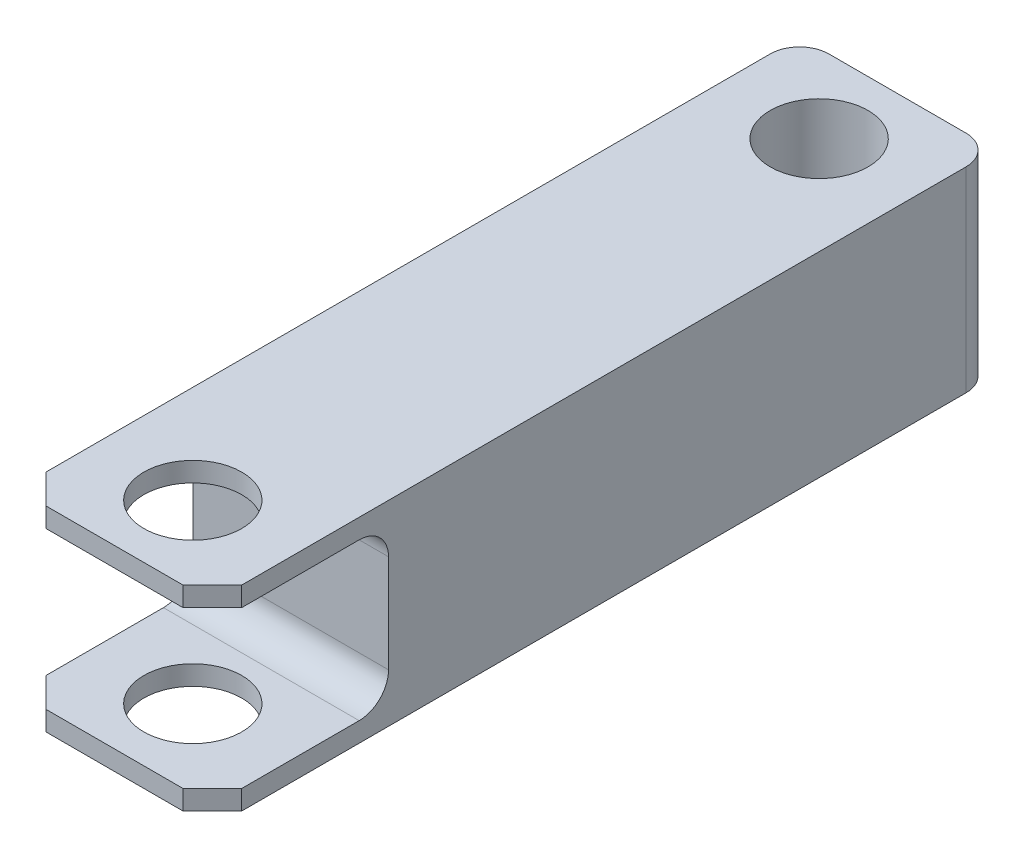
ISO-10303-21;
HEADER;
FILE_DESCRIPTION(('STEP AP214'),'2;1');
FILE_NAME('part.step','',(''),(''),'','','');
FILE_SCHEMA(('AUTOMOTIVE_DESIGN { 1 0 10303 214 1 1 1 1 }'));
ENDSEC;
DATA;
#1=APPLICATION_CONTEXT('core data for automotive mechanical design processes');
#2=APPLICATION_PROTOCOL_DEFINITION('international standard','automotive_design',2000,#1);
#3=PRODUCT_CONTEXT('',#1,'mechanical');
#4=PRODUCT('Part','Part','',(#3));
#5=PRODUCT_RELATED_PRODUCT_CATEGORY('part','',(#4));
#6=PRODUCT_DEFINITION_FORMATION('','',#4);
#7=PRODUCT_DEFINITION_CONTEXT('part definition',#1,'design');
#8=PRODUCT_DEFINITION('design','',#6,#7);
#9=PRODUCT_DEFINITION_SHAPE('','',#8);
#10=(LENGTH_UNIT() NAMED_UNIT(*) SI_UNIT(.MILLI.,.METRE.));
#11=(NAMED_UNIT(*) PLANE_ANGLE_UNIT() SI_UNIT($,.RADIAN.));
#12=(NAMED_UNIT(*) SI_UNIT($,.STERADIAN.) SOLID_ANGLE_UNIT());
#13=UNCERTAINTY_MEASURE_WITH_UNIT(LENGTH_MEASURE(1.E-05),#10,'distance_accuracy_value','');
#14=(GEOMETRIC_REPRESENTATION_CONTEXT(3) GLOBAL_UNCERTAINTY_ASSIGNED_CONTEXT((#13)) GLOBAL_UNIT_ASSIGNED_CONTEXT((#10,
#11,#12)) REPRESENTATION_CONTEXT('',''));
#15=CARTESIAN_POINT('',(0.,0.,0.));
#16=DIRECTION('',(0.,0.,1.));
#17=DIRECTION('',(1.,0.,0.));
#18=AXIS2_PLACEMENT_3D('',#15,#16,#17);
#19=CARTESIAN_POINT('',(0.,0.,80.));
#20=DIRECTION('',(0.,0.,-1.));
#21=DIRECTION('',(-1.,0.,0.));
#22=AXIS2_PLACEMENT_3D('',#19,#20,#21);
#23=PLANE('',#22);
#24=DIRECTION('',(-1.,0.,0.));
#25=VECTOR('',#24,1.);
#26=CARTESIAN_POINT('',(10.,8.,80.));
#27=LINE('',#26,#25);
#28=CARTESIAN_POINT('',(6.99999999999999,8.,80.));
#29=VERTEX_POINT('',#28);
#30=CARTESIAN_POINT('',(-6.99999999999999,8.,80.));
#31=VERTEX_POINT('',#30);
#32=EDGE_CURVE('E175',#29,#31,#27,.T.);
#33=ORIENTED_EDGE('',*,*,#32,.F.);
#34=DIRECTION('',(0.,1.,0.));
#35=VECTOR('',#34,1.);
#36=CARTESIAN_POINT('',(6.99999999999999,0.,80.));
#37=LINE('',#36,#35);
#38=CARTESIAN_POINT('',(6.99999999999999,10.,80.));
#39=VERTEX_POINT('',#38);
#40=EDGE_CURVE('E258',#29,#39,#37,.T.);
#41=ORIENTED_EDGE('',*,*,#40,.T.);
#42=DIRECTION('',(-1.,0.,0.));
#43=VECTOR('',#42,1.);
#44=CARTESIAN_POINT('',(-10.,10.,80.));
#45=LINE('',#44,#43);
#46=CARTESIAN_POINT('',(-7.,10.,80.));
#47=VERTEX_POINT('',#46);
#48=EDGE_CURVE('E202',#39,#47,#45,.T.);
#49=ORIENTED_EDGE('',*,*,#48,.T.);
#50=DIRECTION('',(0.,-1.,0.));
#51=VECTOR('',#50,1.);
#52=CARTESIAN_POINT('',(-7.,0.,80.));
#53=LINE('',#52,#51);
#54=EDGE_CURVE('E255',#47,#31,#53,.T.);
#55=ORIENTED_EDGE('',*,*,#54,.T.);
#56=EDGE_LOOP('',(#33,#41,#49,#55));
#57=FACE_BOUND('',#56,.T.);
#58=ADVANCED_FACE('F34',(#57),#23,.F.);
#59=CARTESIAN_POINT('',(10.,-10.,80.));
#60=DIRECTION('',(-1.,0.,0.));
#61=DIRECTION('',(0.,0.,1.));
#62=AXIS2_PLACEMENT_3D('',#59,#60,#61);
#63=PLANE('',#62);
#64=DIRECTION('',(0.,0.,-1.));
#65=VECTOR('',#64,1.);
#66=CARTESIAN_POINT('',(10.,10.,80.));
#67=LINE('',#66,#65);
#68=CARTESIAN_POINT('',(10.,10.,77.));
#69=VERTEX_POINT('',#68);
#70=CARTESIAN_POINT('',(10.,10.,3.));
#71=VERTEX_POINT('',#70);
#72=EDGE_CURVE('E219',#69,#71,#67,.T.);
#73=ORIENTED_EDGE('',*,*,#72,.F.);
#74=DIRECTION('',(0.,-1.,0.));
#75=VECTOR('',#74,1.);
#76=CARTESIAN_POINT('',(10.,-10.,77.));
#77=LINE('',#76,#75);
#78=CARTESIAN_POINT('',(10.,8.,77.));
#79=VERTEX_POINT('',#78);
#80=EDGE_CURVE('E267',#69,#79,#77,.T.);
#81=ORIENTED_EDGE('',*,*,#80,.T.);
#82=DIRECTION('',(0.,0.,1.));
#83=VECTOR('',#82,1.);
#84=CARTESIAN_POINT('',(10.,8.,62.));
#85=LINE('',#84,#83);
#86=CARTESIAN_POINT('',(10.,8.,65.));
#87=VERTEX_POINT('',#86);
#88=EDGE_CURVE('E191',#87,#79,#85,.T.);
#89=ORIENTED_EDGE('',*,*,#88,.F.);
#90=CARTESIAN_POINT('',(10.,5.,65.));
#91=DIRECTION('',(-1.,0.,0.));
#92=DIRECTION('',(0.,0.,1.));
#93=AXIS2_PLACEMENT_3D('',#90,#91,#92);
#94=CIRCLE('',#93,3.);
#95=CARTESIAN_POINT('',(10.,5.,62.));
#96=VERTEX_POINT('',#95);
#97=EDGE_CURVE('E157',#87,#96,#94,.T.);
#98=ORIENTED_EDGE('',*,*,#97,.T.);
#99=DIRECTION('',(0.,1.,0.));
#100=VECTOR('',#99,1.);
#101=CARTESIAN_POINT('',(10.,-8.,62.));
#102=LINE('',#101,#100);
#103=CARTESIAN_POINT('',(10.,-5.,62.));
#104=VERTEX_POINT('',#103);
#105=EDGE_CURVE('E168',#104,#96,#102,.T.);
#106=ORIENTED_EDGE('',*,*,#105,.F.);
#107=CARTESIAN_POINT('',(10.,-5.,65.));
#108=DIRECTION('',(-1.,0.,0.));
#109=DIRECTION('',(0.,0.,1.));
#110=AXIS2_PLACEMENT_3D('',#107,#108,#109);
#111=CIRCLE('',#110,3.);
#112=CARTESIAN_POINT('',(10.,-8.,65.));
#113=VERTEX_POINT('',#112);
#114=EDGE_CURVE('E251',#104,#113,#111,.T.);
#115=ORIENTED_EDGE('',*,*,#114,.T.);
#116=DIRECTION('',(0.,0.,1.));
#117=VECTOR('',#116,1.);
#118=CARTESIAN_POINT('',(10.,-8.,62.));
#119=LINE('',#118,#117);
#120=CARTESIAN_POINT('',(10.,-8.,77.));
#121=VERTEX_POINT('',#120);
#122=EDGE_CURVE('E194',#113,#121,#119,.T.);
#123=ORIENTED_EDGE('',*,*,#122,.T.);
#124=DIRECTION('',(0.,-1.,0.));
#125=VECTOR('',#124,1.);
#126=CARTESIAN_POINT('',(10.,-10.,77.));
#127=LINE('',#126,#125);
#128=CARTESIAN_POINT('',(10.,-10.,77.));
#129=VERTEX_POINT('',#128);
#130=EDGE_CURVE('E265',#121,#129,#127,.T.);
#131=ORIENTED_EDGE('',*,*,#130,.T.);
#132=DIRECTION('',(0.,0.,-1.));
#133=VECTOR('',#132,1.);
#134=CARTESIAN_POINT('',(10.,-10.,80.));
#135=LINE('',#134,#133);
#136=CARTESIAN_POINT('',(10.,-10.,3.));
#137=VERTEX_POINT('',#136);
#138=EDGE_CURVE('E208',#129,#137,#135,.T.);
#139=ORIENTED_EDGE('',*,*,#138,.T.);
#140=DIRECTION('',(0.,1.,0.));
#141=VECTOR('',#140,1.);
#142=CARTESIAN_POINT('',(10.,10.,3.));
#143=LINE('',#142,#141);
#144=EDGE_CURVE('E170',#137,#71,#143,.T.);
#145=ORIENTED_EDGE('',*,*,#144,.T.);
#146=EDGE_LOOP('',(#73,#81,#89,#98,#106,#115,#123,#131,#139,#145));
#147=FACE_BOUND('',#146,.T.);
#148=ADVANCED_FACE('F303',(#147),#63,.F.);
#149=CARTESIAN_POINT('',(-10.,10.,80.));
#150=DIRECTION('',(0.,-1.,0.));
#151=DIRECTION('',(0.,0.,-1.));
#152=AXIS2_PLACEMENT_3D('',#149,#150,#151);
#153=PLANE('',#152);
#154=CARTESIAN_POINT('',(0.,9.99999999999999,72.));
#155=DIRECTION('',(0.,-1.,0.));
#156=DIRECTION('',(0.,0.,-1.));
#157=AXIS2_PLACEMENT_3D('',#154,#155,#156);
#158=CIRCLE('',#157,5.);
#159=CARTESIAN_POINT('',(0.,9.99999999999999,67.));
#160=VERTEX_POINT('',#159);
#161=EDGE_CURVE('E183',#160,#160,#158,.T.);
#162=ORIENTED_EDGE('',*,*,#161,.T.);
#163=EDGE_LOOP('',(#162));
#164=FACE_BOUND('',#163,.T.);
#165=CARTESIAN_POINT('',(0.,10.,8.));
#166=DIRECTION('',(0.,1.,0.));
#167=DIRECTION('',(0.,0.,1.));
#168=AXIS2_PLACEMENT_3D('',#165,#166,#167);
#169=CIRCLE('',#168,5.);
#170=CARTESIAN_POINT('',(0.,10.,13.));
#171=VERTEX_POINT('',#170);
#172=EDGE_CURVE('E190',#171,#171,#169,.T.);
#173=ORIENTED_EDGE('',*,*,#172,.F.);
#174=EDGE_LOOP('',(#173));
#175=FACE_BOUND('',#174,.T.);
#176=ORIENTED_EDGE('',*,*,#48,.F.);
#177=DIRECTION('',(-0.707106781186547,0.,0.707106781186548));
#178=VECTOR('',#177,1.);
#179=CARTESIAN_POINT('',(6.99999999999999,10.,80.));
#180=LINE('',#179,#178);
#181=EDGE_CURVE('E263',#39,#69,#180,.F.);
#182=ORIENTED_EDGE('',*,*,#181,.T.);
#183=ORIENTED_EDGE('',*,*,#72,.T.);
#184=CARTESIAN_POINT('',(7.,10.,3.));
#185=DIRECTION('',(0.,-1.,0.));
#186=DIRECTION('',(0.,0.,-1.));
#187=AXIS2_PLACEMENT_3D('',#184,#185,#186);
#188=CIRCLE('',#187,3.);
#189=CARTESIAN_POINT('',(7.,10.,0.));
#190=VERTEX_POINT('',#189);
#191=EDGE_CURVE('E240',#71,#190,#188,.F.);
#192=ORIENTED_EDGE('',*,*,#191,.T.);
#193=DIRECTION('',(-1.,0.,0.));
#194=VECTOR('',#193,1.);
#195=CARTESIAN_POINT('',(-10.,10.,0.));
#196=LINE('',#195,#194);
#197=CARTESIAN_POINT('',(-7.,10.,0.));
#198=VERTEX_POINT('',#197);
#199=EDGE_CURVE('E209',#190,#198,#196,.T.);
#200=ORIENTED_EDGE('',*,*,#199,.T.);
#201=CARTESIAN_POINT('',(-7.,10.,3.));
#202=DIRECTION('',(0.,-1.,0.));
#203=DIRECTION('',(0.,0.,-1.));
#204=AXIS2_PLACEMENT_3D('',#201,#202,#203);
#205=CIRCLE('',#204,3.);
#206=CARTESIAN_POINT('',(-10.,10.,3.));
#207=VERTEX_POINT('',#206);
#208=EDGE_CURVE('E242',#198,#207,#205,.F.);
#209=ORIENTED_EDGE('',*,*,#208,.T.);
#210=DIRECTION('',(0.,0.,-1.));
#211=VECTOR('',#210,1.);
#212=CARTESIAN_POINT('',(-10.,10.,80.));
#213=LINE('',#212,#211);
#214=CARTESIAN_POINT('',(-10.,10.,77.));
#215=VERTEX_POINT('',#214);
#216=EDGE_CURVE('E217',#215,#207,#213,.T.);
#217=ORIENTED_EDGE('',*,*,#216,.F.);
#218=DIRECTION('',(-0.707106781186548,0.,-0.707106781186548));
#219=VECTOR('',#218,1.);
#220=CARTESIAN_POINT('',(-7.,10.,80.));
#221=LINE('',#220,#219);
#222=EDGE_CURVE('E261',#215,#47,#221,.F.);
#223=ORIENTED_EDGE('',*,*,#222,.T.);
#224=EDGE_LOOP('',(#176,#182,#183,#192,#200,#209,#217,#223));
#225=FACE_BOUND('',#224,.T.);
#226=ADVANCED_FACE('F324',(#164,#175,#225),#153,.F.);
#227=CARTESIAN_POINT('',(-10.,-10.,80.));
#228=DIRECTION('',(1.,0.,0.));
#229=DIRECTION('',(0.,0.,-1.));
#230=AXIS2_PLACEMENT_3D('',#227,#228,#229);
#231=PLANE('',#230);
#232=DIRECTION('',(0.,0.,1.));
#233=VECTOR('',#232,1.);
#234=CARTESIAN_POINT('',(-10.,8.,62.));
#235=LINE('',#234,#233);
#236=CARTESIAN_POINT('',(-10.,8.,65.));
#237=VERTEX_POINT('',#236);
#238=CARTESIAN_POINT('',(-10.,8.,77.));
#239=VERTEX_POINT('',#238);
#240=EDGE_CURVE('E188',#237,#239,#235,.T.);
#241=ORIENTED_EDGE('',*,*,#240,.T.);
#242=DIRECTION('',(0.,1.,0.));
#243=VECTOR('',#242,1.);
#244=CARTESIAN_POINT('',(-10.,-10.,77.));
#245=LINE('',#244,#243);
#246=EDGE_CURVE('E275',#239,#215,#245,.T.);
#247=ORIENTED_EDGE('',*,*,#246,.T.);
#248=ORIENTED_EDGE('',*,*,#216,.T.);
#249=DIRECTION('',(0.,-1.,0.));
#250=VECTOR('',#249,1.);
#251=CARTESIAN_POINT('',(-10.,-10.,3.));
#252=LINE('',#251,#250);
#253=CARTESIAN_POINT('',(-10.,-10.,3.));
#254=VERTEX_POINT('',#253);
#255=EDGE_CURVE('E221',#207,#254,#252,.T.);
#256=ORIENTED_EDGE('',*,*,#255,.T.);
#257=DIRECTION('',(0.,0.,-1.));
#258=VECTOR('',#257,1.);
#259=CARTESIAN_POINT('',(-10.,-10.,80.));
#260=LINE('',#259,#258);
#261=CARTESIAN_POINT('',(-10.,-10.,77.));
#262=VERTEX_POINT('',#261);
#263=EDGE_CURVE('E215',#262,#254,#260,.T.);
#264=ORIENTED_EDGE('',*,*,#263,.F.);
#265=DIRECTION('',(0.,1.,0.));
#266=VECTOR('',#265,1.);
#267=CARTESIAN_POINT('',(-10.,-10.,77.));
#268=LINE('',#267,#266);
#269=CARTESIAN_POINT('',(-10.,-8.,77.));
#270=VERTEX_POINT('',#269);
#271=EDGE_CURVE('E273',#262,#270,#268,.T.);
#272=ORIENTED_EDGE('',*,*,#271,.T.);
#273=DIRECTION('',(0.,0.,1.));
#274=VECTOR('',#273,1.);
#275=CARTESIAN_POINT('',(-10.,-8.,62.));
#276=LINE('',#275,#274);
#277=CARTESIAN_POINT('',(-10.,-8.,65.));
#278=VERTEX_POINT('',#277);
#279=EDGE_CURVE('E177',#278,#270,#276,.T.);
#280=ORIENTED_EDGE('',*,*,#279,.F.);
#281=CARTESIAN_POINT('',(-10.,-5.,65.));
#282=DIRECTION('',(1.,0.,0.));
#283=DIRECTION('',(0.,0.,-1.));
#284=AXIS2_PLACEMENT_3D('',#281,#282,#283);
#285=CIRCLE('',#284,3.);
#286=CARTESIAN_POINT('',(-10.,-5.,62.));
#287=VERTEX_POINT('',#286);
#288=EDGE_CURVE('E158',#278,#287,#285,.T.);
#289=ORIENTED_EDGE('',*,*,#288,.T.);
#290=DIRECTION('',(0.,-1.,0.));
#291=VECTOR('',#290,1.);
#292=CARTESIAN_POINT('',(-10.,-8.,62.));
#293=LINE('',#292,#291);
#294=CARTESIAN_POINT('',(-10.,5.,62.));
#295=VERTEX_POINT('',#294);
#296=EDGE_CURVE('E165',#295,#287,#293,.T.);
#297=ORIENTED_EDGE('',*,*,#296,.F.);
#298=CARTESIAN_POINT('',(-10.,5.,65.));
#299=DIRECTION('',(1.,0.,0.));
#300=DIRECTION('',(0.,0.,-1.));
#301=AXIS2_PLACEMENT_3D('',#298,#299,#300);
#302=CIRCLE('',#301,3.);
#303=EDGE_CURVE('E147',#295,#237,#302,.T.);
#304=ORIENTED_EDGE('',*,*,#303,.T.);
#305=EDGE_LOOP('',(#241,#247,#248,#256,#264,#272,#280,#289,#297,#304));
#306=FACE_BOUND('',#305,.T.);
#307=ADVANCED_FACE('F172',(#306),#231,.F.);
#308=CARTESIAN_POINT('',(-10.,-10.,80.));
#309=DIRECTION('',(0.,1.,0.));
#310=DIRECTION('',(0.,0.,1.));
#311=AXIS2_PLACEMENT_3D('',#308,#309,#310);
#312=PLANE('',#311);
#313=CARTESIAN_POINT('',(0.,-10.,72.));
#314=DIRECTION('',(0.,-1.,0.));
#315=DIRECTION('',(0.,0.,-1.));
#316=AXIS2_PLACEMENT_3D('',#313,#314,#315);
#317=CIRCLE('',#316,5.);
#318=CARTESIAN_POINT('',(0.,-10.,67.));
#319=VERTEX_POINT('',#318);
#320=EDGE_CURVE('E228',#319,#319,#317,.T.);
#321=ORIENTED_EDGE('',*,*,#320,.F.);
#322=EDGE_LOOP('',(#321));
#323=FACE_BOUND('',#322,.T.);
#324=CARTESIAN_POINT('',(0.,-10.,8.));
#325=DIRECTION('',(0.,1.,0.));
#326=DIRECTION('',(0.,0.,1.));
#327=AXIS2_PLACEMENT_3D('',#324,#325,#326);
#328=CIRCLE('',#327,5.);
#329=CARTESIAN_POINT('',(0.,-10.,13.));
#330=VERTEX_POINT('',#329);
#331=EDGE_CURVE('E201',#330,#330,#328,.T.);
#332=ORIENTED_EDGE('',*,*,#331,.T.);
#333=EDGE_LOOP('',(#332));
#334=FACE_BOUND('',#333,.T.);
#335=ORIENTED_EDGE('',*,*,#138,.F.);
#336=DIRECTION('',(0.707106781186547,0.,-0.707106781186548));
#337=VECTOR('',#336,1.);
#338=CARTESIAN_POINT('',(6.99999999999999,-10.,80.));
#339=LINE('',#338,#337);
#340=CARTESIAN_POINT('',(6.99999999999999,-10.,80.));
#341=VERTEX_POINT('',#340);
#342=EDGE_CURVE('E11',#129,#341,#339,.F.);
#343=ORIENTED_EDGE('',*,*,#342,.T.);
#344=DIRECTION('',(1.,0.,0.));
#345=VECTOR('',#344,1.);
#346=CARTESIAN_POINT('',(-10.,-10.,80.));
#347=LINE('',#346,#345);
#348=CARTESIAN_POINT('',(-7.,-10.,80.));
#349=VERTEX_POINT('',#348);
#350=EDGE_CURVE('E205',#349,#341,#347,.T.);
#351=ORIENTED_EDGE('',*,*,#350,.F.);
#352=DIRECTION('',(0.707106781186548,0.,0.707106781186548));
#353=VECTOR('',#352,1.);
#354=CARTESIAN_POINT('',(-7.,-10.,80.));
#355=LINE('',#354,#353);
#356=EDGE_CURVE('E42',#349,#262,#355,.F.);
#357=ORIENTED_EDGE('',*,*,#356,.T.);
#358=ORIENTED_EDGE('',*,*,#263,.T.);
#359=CARTESIAN_POINT('',(-7.,-10.,3.));
#360=DIRECTION('',(0.,1.,0.));
#361=DIRECTION('',(0.,0.,1.));
#362=AXIS2_PLACEMENT_3D('',#359,#360,#361);
#363=CIRCLE('',#362,3.);
#364=CARTESIAN_POINT('',(-7.,-10.,0.));
#365=VERTEX_POINT('',#364);
#366=EDGE_CURVE('E234',#254,#365,#363,.F.);
#367=ORIENTED_EDGE('',*,*,#366,.T.);
#368=DIRECTION('',(1.,0.,0.));
#369=VECTOR('',#368,1.);
#370=CARTESIAN_POINT('',(-10.,-10.,0.));
#371=LINE('',#370,#369);
#372=CARTESIAN_POINT('',(7.,-10.,0.));
#373=VERTEX_POINT('',#372);
#374=EDGE_CURVE('E206',#365,#373,#371,.T.);
#375=ORIENTED_EDGE('',*,*,#374,.T.);
#376=CARTESIAN_POINT('',(7.,-10.,3.));
#377=DIRECTION('',(0.,1.,0.));
#378=DIRECTION('',(0.,0.,1.));
#379=AXIS2_PLACEMENT_3D('',#376,#377,#378);
#380=CIRCLE('',#379,3.);
#381=EDGE_CURVE('E231',#373,#137,#380,.F.);
#382=ORIENTED_EDGE('',*,*,#381,.T.);
#383=EDGE_LOOP('',(#335,#343,#351,#357,#358,#367,#375,#382));
#384=FACE_BOUND('',#383,.T.);
#385=ADVANCED_FACE('F286',(#323,#334,#384),#312,.F.);
#386=ORIENTED_EDGE('',*,*,#350,.T.);
#387=DIRECTION('',(0.,1.,0.));
#388=VECTOR('',#387,1.);
#389=CARTESIAN_POINT('',(6.99999999999999,0.,80.));
#390=LINE('',#389,#388);
#391=CARTESIAN_POINT('',(6.99999999999999,-8.,80.));
#392=VERTEX_POINT('',#391);
#393=EDGE_CURVE('E279',#341,#392,#390,.T.);
#394=ORIENTED_EDGE('',*,*,#393,.T.);
#395=DIRECTION('',(1.,0.,0.));
#396=VECTOR('',#395,1.);
#397=CARTESIAN_POINT('',(10.,-8.,80.));
#398=LINE('',#397,#396);
#399=CARTESIAN_POINT('',(-6.99999999999999,-8.,80.));
#400=VERTEX_POINT('',#399);
#401=EDGE_CURVE('E180',#400,#392,#398,.T.);
#402=ORIENTED_EDGE('',*,*,#401,.F.);
#403=DIRECTION('',(0.,-1.,0.));
#404=VECTOR('',#403,1.);
#405=CARTESIAN_POINT('',(-7.,0.,80.));
#406=LINE('',#405,#404);
#407=EDGE_CURVE('E277',#400,#349,#406,.T.);
#408=ORIENTED_EDGE('',*,*,#407,.T.);
#409=EDGE_LOOP('',(#386,#394,#402,#408));
#410=FACE_BOUND('',#409,.T.);
#411=ADVANCED_FACE('F294',(#410),#23,.F.);
#412=CARTESIAN_POINT('',(0.,0.,0.));
#413=DIRECTION('',(0.,0.,-1.));
#414=DIRECTION('',(-1.,0.,0.));
#415=AXIS2_PLACEMENT_3D('',#412,#413,#414);
#416=PLANE('',#415);
#417=ORIENTED_EDGE('',*,*,#374,.F.);
#418=DIRECTION('',(0.,-1.,0.));
#419=VECTOR('',#418,1.);
#420=CARTESIAN_POINT('',(-7.,10.,0.));
#421=LINE('',#420,#419);
#422=EDGE_CURVE('E238',#365,#198,#421,.F.);
#423=ORIENTED_EDGE('',*,*,#422,.T.);
#424=ORIENTED_EDGE('',*,*,#199,.F.);
#425=DIRECTION('',(0.,1.,0.));
#426=VECTOR('',#425,1.);
#427=CARTESIAN_POINT('',(7.,-10.,0.));
#428=LINE('',#427,#426);
#429=EDGE_CURVE('E236',#190,#373,#428,.F.);
#430=ORIENTED_EDGE('',*,*,#429,.T.);
#431=EDGE_LOOP('',(#417,#423,#424,#430));
#432=FACE_BOUND('',#431,.T.);
#433=ADVANCED_FACE('F330',(#432),#416,.T.);
#434=CARTESIAN_POINT('',(0.,-70.,8.));
#435=DIRECTION('',(0.,1.,0.));
#436=DIRECTION('',(0.,0.,1.));
#437=AXIS2_PLACEMENT_3D('',#434,#435,#436);
#438=CYLINDRICAL_SURFACE('',#437,5.);
#439=ORIENTED_EDGE('',*,*,#172,.T.);
#440=EDGE_LOOP('',(#439));
#441=FACE_BOUND('',#440,.T.);
#442=ORIENTED_EDGE('',*,*,#331,.F.);
#443=EDGE_LOOP('',(#442));
#444=FACE_BOUND('',#443,.T.);
#445=ADVANCED_FACE('F335',(#441,#444),#438,.F.);
#446=CARTESIAN_POINT('',(10.,8.,62.));
#447=DIRECTION('',(0.,1.,0.));
#448=DIRECTION('',(0.,0.,1.));
#449=AXIS2_PLACEMENT_3D('',#446,#447,#448);
#450=PLANE('',#449);
#451=CARTESIAN_POINT('',(0.,7.99999999999999,72.));
#452=DIRECTION('',(0.,1.,0.));
#453=DIRECTION('',(0.,0.,1.));
#454=AXIS2_PLACEMENT_3D('',#451,#452,#453);
#455=CIRCLE('',#454,5.);
#456=CARTESIAN_POINT('',(0.,7.99999999999999,77.));
#457=VERTEX_POINT('',#456);
#458=EDGE_CURVE('E227',#457,#457,#455,.T.);
#459=ORIENTED_EDGE('',*,*,#458,.T.);
#460=EDGE_LOOP('',(#459));
#461=FACE_BOUND('',#460,.T.);
#462=ORIENTED_EDGE('',*,*,#88,.T.);
#463=DIRECTION('',(0.707106781186547,0.,-0.707106781186548));
#464=VECTOR('',#463,1.);
#465=CARTESIAN_POINT('',(6.99999999999999,8.,80.));
#466=LINE('',#465,#464);
#467=EDGE_CURVE('E271',#79,#29,#466,.F.);
#468=ORIENTED_EDGE('',*,*,#467,.T.);
#469=ORIENTED_EDGE('',*,*,#32,.T.);
#470=DIRECTION('',(0.707106781186548,0.,0.707106781186548));
#471=VECTOR('',#470,1.);
#472=CARTESIAN_POINT('',(-7.,8.,80.));
#473=LINE('',#472,#471);
#474=EDGE_CURVE('E269',#31,#239,#473,.F.);
#475=ORIENTED_EDGE('',*,*,#474,.T.);
#476=ORIENTED_EDGE('',*,*,#240,.F.);
#477=DIRECTION('',(-1.,0.,0.));
#478=VECTOR('',#477,1.);
#479=CARTESIAN_POINT('',(10.,8.,65.));
#480=LINE('',#479,#478);
#481=EDGE_CURVE('E152',#237,#87,#480,.F.);
#482=ORIENTED_EDGE('',*,*,#481,.T.);
#483=EDGE_LOOP('',(#462,#468,#469,#475,#476,#482));
#484=FACE_BOUND('',#483,.T.);
#485=ADVANCED_FACE('F376',(#461,#484),#450,.F.);
#486=CARTESIAN_POINT('',(10.,-8.,62.));
#487=DIRECTION('',(0.,-1.,0.));
#488=DIRECTION('',(0.,0.,-1.));
#489=AXIS2_PLACEMENT_3D('',#486,#487,#488);
#490=PLANE('',#489);
#491=CARTESIAN_POINT('',(0.,-7.99999999999999,72.));
#492=DIRECTION('',(0.,-1.,0.));
#493=DIRECTION('',(0.,0.,-1.));
#494=AXIS2_PLACEMENT_3D('',#491,#492,#493);
#495=CIRCLE('',#494,5.);
#496=CARTESIAN_POINT('',(0.,-7.99999999999999,67.));
#497=VERTEX_POINT('',#496);
#498=EDGE_CURVE('E224',#497,#497,#495,.T.);
#499=ORIENTED_EDGE('',*,*,#498,.T.);
#500=EDGE_LOOP('',(#499));
#501=FACE_BOUND('',#500,.T.);
#502=ORIENTED_EDGE('',*,*,#401,.T.);
#503=DIRECTION('',(-0.707106781186547,0.,0.707106781186548));
#504=VECTOR('',#503,1.);
#505=CARTESIAN_POINT('',(6.99999999999999,-8.,80.));
#506=LINE('',#505,#504);
#507=EDGE_CURVE('E284',#392,#121,#506,.F.);
#508=ORIENTED_EDGE('',*,*,#507,.T.);
#509=ORIENTED_EDGE('',*,*,#122,.F.);
#510=DIRECTION('',(1.,0.,0.));
#511=VECTOR('',#510,1.);
#512=CARTESIAN_POINT('',(10.,-8.,65.));
#513=LINE('',#512,#511);
#514=EDGE_CURVE('E248',#113,#278,#513,.F.);
#515=ORIENTED_EDGE('',*,*,#514,.T.);
#516=ORIENTED_EDGE('',*,*,#279,.T.);
#517=DIRECTION('',(-0.707106781186548,0.,-0.707106781186548));
#518=VECTOR('',#517,1.);
#519=CARTESIAN_POINT('',(-7.,-8.,80.));
#520=LINE('',#519,#518);
#521=EDGE_CURVE('E282',#270,#400,#520,.F.);
#522=ORIENTED_EDGE('',*,*,#521,.T.);
#523=EDGE_LOOP('',(#502,#508,#509,#515,#516,#522));
#524=FACE_BOUND('',#523,.T.);
#525=ADVANCED_FACE('F292',(#501,#524),#490,.F.);
#526=CARTESIAN_POINT('',(0.,0.,62.));
#527=DIRECTION('',(0.,0.,1.));
#528=DIRECTION('',(1.,0.,0.));
#529=AXIS2_PLACEMENT_3D('',#526,#527,#528);
#530=PLANE('',#529);
#531=ORIENTED_EDGE('',*,*,#296,.T.);
#532=DIRECTION('',(1.,0.,0.));
#533=VECTOR('',#532,1.);
#534=CARTESIAN_POINT('',(0.,-5.,62.));
#535=LINE('',#534,#533);
#536=EDGE_CURVE('E169',#287,#104,#535,.T.);
#537=ORIENTED_EDGE('',*,*,#536,.T.);
#538=ORIENTED_EDGE('',*,*,#105,.T.);
#539=DIRECTION('',(-1.,0.,0.));
#540=VECTOR('',#539,1.);
#541=CARTESIAN_POINT('',(0.,5.,62.));
#542=LINE('',#541,#540);
#543=EDGE_CURVE('E151',#96,#295,#542,.T.);
#544=ORIENTED_EDGE('',*,*,#543,.T.);
#545=EDGE_LOOP('',(#531,#537,#538,#544));
#546=FACE_BOUND('',#545,.T.);
#547=ADVANCED_FACE('F163',(#546),#530,.T.);
#548=CARTESIAN_POINT('',(0.,82.,72.));
#549=DIRECTION('',(0.,-1.,0.));
#550=DIRECTION('',(0.,0.,-1.));
#551=AXIS2_PLACEMENT_3D('',#548,#549,#550);
#552=CYLINDRICAL_SURFACE('',#551,5.);
#553=ORIENTED_EDGE('',*,*,#320,.T.);
#554=EDGE_LOOP('',(#553));
#555=FACE_BOUND('',#554,.T.);
#556=ORIENTED_EDGE('',*,*,#498,.F.);
#557=EDGE_LOOP('',(#556));
#558=FACE_BOUND('',#557,.T.);
#559=ADVANCED_FACE('F355',(#555,#558),#552,.F.);
#560=ORIENTED_EDGE('',*,*,#458,.F.);
#561=EDGE_LOOP('',(#560));
#562=FACE_BOUND('',#561,.T.);
#563=ORIENTED_EDGE('',*,*,#161,.F.);
#564=EDGE_LOOP('',(#563));
#565=FACE_BOUND('',#564,.T.);
#566=ADVANCED_FACE('F350',(#562,#565),#552,.F.);
#567=CARTESIAN_POINT('',(-7.,-10.,3.));
#568=DIRECTION('',(0.,1.,0.));
#569=DIRECTION('',(0.,0.,1.));
#570=AXIS2_PLACEMENT_3D('',#567,#568,#569);
#571=CYLINDRICAL_SURFACE('',#570,3.);
#572=ORIENTED_EDGE('',*,*,#208,.F.);
#573=ORIENTED_EDGE('',*,*,#422,.F.);
#574=ORIENTED_EDGE('',*,*,#366,.F.);
#575=ORIENTED_EDGE('',*,*,#255,.F.);
#576=EDGE_LOOP('',(#572,#573,#574,#575));
#577=FACE_BOUND('',#576,.T.);
#578=ADVANCED_FACE('F315',(#577),#571,.T.);
#579=CARTESIAN_POINT('',(7.,-10.,3.));
#580=DIRECTION('',(0.,-1.,0.));
#581=DIRECTION('',(0.,0.,-1.));
#582=AXIS2_PLACEMENT_3D('',#579,#580,#581);
#583=CYLINDRICAL_SURFACE('',#582,3.);
#584=ORIENTED_EDGE('',*,*,#381,.F.);
#585=ORIENTED_EDGE('',*,*,#429,.F.);
#586=ORIENTED_EDGE('',*,*,#191,.F.);
#587=ORIENTED_EDGE('',*,*,#144,.F.);
#588=EDGE_LOOP('',(#584,#585,#586,#587));
#589=FACE_BOUND('',#588,.T.);
#590=ADVANCED_FACE('F307',(#589),#583,.T.);
#591=CARTESIAN_POINT('',(0.,-5.,65.));
#592=DIRECTION('',(1.,0.,0.));
#593=DIRECTION('',(0.,0.,-1.));
#594=AXIS2_PLACEMENT_3D('',#591,#592,#593);
#595=CYLINDRICAL_SURFACE('',#594,3.);
#596=ORIENTED_EDGE('',*,*,#288,.F.);
#597=ORIENTED_EDGE('',*,*,#514,.F.);
#598=ORIENTED_EDGE('',*,*,#114,.F.);
#599=ORIENTED_EDGE('',*,*,#536,.F.);
#600=EDGE_LOOP('',(#596,#597,#598,#599));
#601=FACE_BOUND('',#600,.T.);
#602=ADVANCED_FACE('F305',(#601),#595,.F.);
#603=CARTESIAN_POINT('',(0.,5.,65.));
#604=DIRECTION('',(-1.,0.,0.));
#605=DIRECTION('',(0.,0.,1.));
#606=AXIS2_PLACEMENT_3D('',#603,#604,#605);
#607=CYLINDRICAL_SURFACE('',#606,3.);
#608=ORIENTED_EDGE('',*,*,#97,.F.);
#609=ORIENTED_EDGE('',*,*,#481,.F.);
#610=ORIENTED_EDGE('',*,*,#303,.F.);
#611=ORIENTED_EDGE('',*,*,#543,.F.);
#612=EDGE_LOOP('',(#608,#609,#610,#611));
#613=FACE_BOUND('',#612,.T.);
#614=ADVANCED_FACE('F150',(#613),#607,.F.);
#615=CARTESIAN_POINT('',(6.99999999999999,0.,80.));
#616=DIRECTION('',(-0.707106781186548,0.,-0.707106781186547));
#617=DIRECTION('',(0.,1.,0.));
#618=AXIS2_PLACEMENT_3D('',#615,#616,#617);
#619=PLANE('',#618);
#620=ORIENTED_EDGE('',*,*,#467,.F.);
#621=ORIENTED_EDGE('',*,*,#80,.F.);
#622=ORIENTED_EDGE('',*,*,#181,.F.);
#623=ORIENTED_EDGE('',*,*,#40,.F.);
#624=EDGE_LOOP('',(#620,#621,#622,#623));
#625=FACE_BOUND('',#624,.T.);
#626=ADVANCED_FACE('F313',(#625),#619,.F.);
#627=CARTESIAN_POINT('',(-7.,0.,80.));
#628=DIRECTION('',(0.707106781186547,0.,-0.707106781186547));
#629=DIRECTION('',(0.,-1.,0.));
#630=AXIS2_PLACEMENT_3D('',#627,#628,#629);
#631=PLANE('',#630);
#632=ORIENTED_EDGE('',*,*,#222,.F.);
#633=ORIENTED_EDGE('',*,*,#246,.F.);
#634=ORIENTED_EDGE('',*,*,#474,.F.);
#635=ORIENTED_EDGE('',*,*,#54,.F.);
#636=EDGE_LOOP('',(#632,#633,#634,#635));
#637=FACE_BOUND('',#636,.T.);
#638=ADVANCED_FACE('F379',(#637),#631,.F.);
#639=CARTESIAN_POINT('',(6.99999999999999,0.,80.));
#640=DIRECTION('',(-0.707106781186548,0.,-0.707106781186547));
#641=DIRECTION('',(0.,1.,0.));
#642=AXIS2_PLACEMENT_3D('',#639,#640,#641);
#643=PLANE('',#642);
#644=ORIENTED_EDGE('',*,*,#342,.F.);
#645=ORIENTED_EDGE('',*,*,#130,.F.);
#646=ORIENTED_EDGE('',*,*,#507,.F.);
#647=ORIENTED_EDGE('',*,*,#393,.F.);
#648=EDGE_LOOP('',(#644,#645,#646,#647));
#649=FACE_BOUND('',#648,.T.);
#650=ADVANCED_FACE('F297',(#649),#643,.F.);
#651=CARTESIAN_POINT('',(-7.,0.,80.));
#652=DIRECTION('',(0.707106781186547,0.,-0.707106781186547));
#653=DIRECTION('',(0.,-1.,0.));
#654=AXIS2_PLACEMENT_3D('',#651,#652,#653);
#655=PLANE('',#654);
#656=ORIENTED_EDGE('',*,*,#521,.F.);
#657=ORIENTED_EDGE('',*,*,#271,.F.);
#658=ORIENTED_EDGE('',*,*,#356,.F.);
#659=ORIENTED_EDGE('',*,*,#407,.F.);
#660=EDGE_LOOP('',(#656,#657,#658,#659));
#661=FACE_BOUND('',#660,.T.);
#662=ADVANCED_FACE('F36',(#661),#655,.F.);
#663=CLOSED_SHELL('',(#58,#148,#226,#307,#385,#411,#433,#445,#485,#525,#547,#559,#566,#578,#590,
#602,#614,#626,#638,#650,#662));
#664=MANIFOLD_SOLID_BREP('B2',#663);
#665=ADVANCED_BREP_SHAPE_REPRESENTATION('',(#18,#664),#14);
#666=SHAPE_DEFINITION_REPRESENTATION(#9,#665);
ENDSEC;
END-ISO-10303-21;
